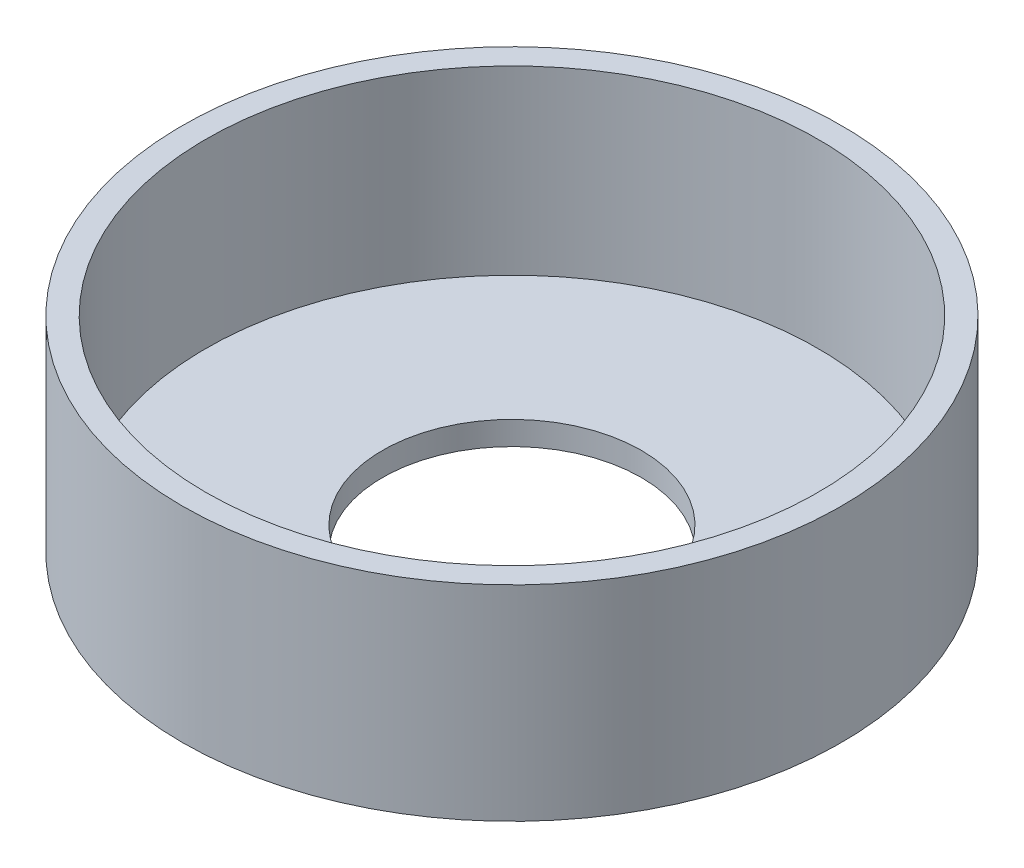
ISO-10303-21;
HEADER;
FILE_DESCRIPTION(('STEP AP214'),'2;1');
FILE_NAME('part.step','',(''),(''),'','','');
FILE_SCHEMA(('AUTOMOTIVE_DESIGN { 1 0 10303 214 1 1 1 1 }'));
ENDSEC;
DATA;
#1=APPLICATION_CONTEXT('core data for automotive mechanical design processes');
#2=APPLICATION_PROTOCOL_DEFINITION('international standard','automotive_design',2000,#1);
#3=PRODUCT_CONTEXT('',#1,'mechanical');
#4=PRODUCT('Part','Part','',(#3));
#5=PRODUCT_RELATED_PRODUCT_CATEGORY('part','',(#4));
#6=PRODUCT_DEFINITION_FORMATION('','',#4);
#7=PRODUCT_DEFINITION_CONTEXT('part definition',#1,'design');
#8=PRODUCT_DEFINITION('design','',#6,#7);
#9=PRODUCT_DEFINITION_SHAPE('','',#8);
#10=(LENGTH_UNIT() NAMED_UNIT(*) SI_UNIT(.MILLI.,.METRE.));
#11=(NAMED_UNIT(*) PLANE_ANGLE_UNIT() SI_UNIT($,.RADIAN.));
#12=(NAMED_UNIT(*) SI_UNIT($,.STERADIAN.) SOLID_ANGLE_UNIT());
#13=UNCERTAINTY_MEASURE_WITH_UNIT(LENGTH_MEASURE(1.E-05),#10,'distance_accuracy_value','');
#14=(GEOMETRIC_REPRESENTATION_CONTEXT(3) GLOBAL_UNCERTAINTY_ASSIGNED_CONTEXT((#13)) GLOBAL_UNIT_ASSIGNED_CONTEXT((#10,
#11,#12)) REPRESENTATION_CONTEXT('',''));
#15=CARTESIAN_POINT('',(0.,0.,0.));
#16=DIRECTION('',(0.,0.,1.));
#17=DIRECTION('',(1.,0.,0.));
#18=AXIS2_PLACEMENT_3D('',#15,#16,#17);
#19=CARTESIAN_POINT('',(0.,11.049,0.));
#20=DIRECTION('',(0.,-1.,0.));
#21=DIRECTION('',(0.,0.,-1.));
#22=AXIS2_PLACEMENT_3D('',#19,#20,#21);
#23=CYLINDRICAL_SURFACE('',#22,17.78);
#24=CARTESIAN_POINT('',(0.,11.049,0.));
#25=DIRECTION('',(0.,1.,0.));
#26=DIRECTION('',(0.,0.,1.));
#27=AXIS2_PLACEMENT_3D('',#24,#25,#26);
#28=CIRCLE('',#27,17.78);
#29=CARTESIAN_POINT('',(0.,11.049,17.78));
#30=VERTEX_POINT('',#29);
#31=EDGE_CURVE('E10',#30,#30,#28,.T.);
#32=ORIENTED_EDGE('',*,*,#31,.F.);
#33=EDGE_LOOP('',(#32));
#34=FACE_BOUND('',#33,.T.);
#35=CARTESIAN_POINT('',(0.,0.,0.));
#36=DIRECTION('',(0.,1.,0.));
#37=DIRECTION('',(0.,0.,1.));
#38=AXIS2_PLACEMENT_3D('',#35,#36,#37);
#39=CIRCLE('',#38,17.78);
#40=CARTESIAN_POINT('',(0.,0.,17.78));
#41=VERTEX_POINT('',#40);
#42=EDGE_CURVE('E33',#41,#41,#39,.T.);
#43=ORIENTED_EDGE('',*,*,#42,.T.);
#44=EDGE_LOOP('',(#43));
#45=FACE_BOUND('',#44,.T.);
#46=ADVANCED_FACE('F30',(#34,#45),#23,.T.);
#47=CARTESIAN_POINT('',(0.,11.049,0.));
#48=DIRECTION('',(0.,1.,0.));
#49=DIRECTION('',(0.,0.,1.));
#50=AXIS2_PLACEMENT_3D('',#47,#48,#49);
#51=PLANE('',#50);
#52=CARTESIAN_POINT('',(0.,11.049,0.));
#53=DIRECTION('',(0.,1.,0.));
#54=DIRECTION('',(0.,0.,1.));
#55=AXIS2_PLACEMENT_3D('',#52,#53,#54);
#56=CIRCLE('',#55,16.51);
#57=CARTESIAN_POINT('',(0.,11.049,16.51));
#58=VERTEX_POINT('',#57);
#59=EDGE_CURVE('E40',#58,#58,#56,.T.);
#60=ORIENTED_EDGE('',*,*,#59,.F.);
#61=EDGE_LOOP('',(#60));
#62=FACE_BOUND('',#61,.T.);
#63=ORIENTED_EDGE('',*,*,#31,.T.);
#64=EDGE_LOOP('',(#63));
#65=FACE_BOUND('',#64,.T.);
#66=ADVANCED_FACE('F76',(#62,#65),#51,.T.);
#67=CARTESIAN_POINT('',(0.,0.,0.));
#68=DIRECTION('',(0.,1.,0.));
#69=DIRECTION('',(0.,0.,1.));
#70=AXIS2_PLACEMENT_3D('',#67,#68,#69);
#71=PLANE('',#70);
#72=CARTESIAN_POINT('',(0.,0.,0.));
#73=DIRECTION('',(0.,1.,0.));
#74=DIRECTION('',(0.,0.,1.));
#75=AXIS2_PLACEMENT_3D('',#72,#73,#74);
#76=CIRCLE('',#75,6.985);
#77=CARTESIAN_POINT('',(0.,0.,6.985));
#78=VERTEX_POINT('',#77);
#79=EDGE_CURVE('E47',#78,#78,#76,.T.);
#80=ORIENTED_EDGE('',*,*,#79,.T.);
#81=EDGE_LOOP('',(#80));
#82=FACE_BOUND('',#81,.T.);
#83=ORIENTED_EDGE('',*,*,#42,.F.);
#84=EDGE_LOOP('',(#83));
#85=FACE_BOUND('',#84,.T.);
#86=ADVANCED_FACE('F54',(#82,#85),#71,.F.);
#87=CARTESIAN_POINT('',(0.,11.049,0.));
#88=DIRECTION('',(0.,-1.,0.));
#89=DIRECTION('',(0.,0.,-1.));
#90=AXIS2_PLACEMENT_3D('',#87,#88,#89);
#91=CYLINDRICAL_SURFACE('',#90,16.51);
#92=ORIENTED_EDGE('',*,*,#59,.T.);
#93=EDGE_LOOP('',(#92));
#94=FACE_BOUND('',#93,.T.);
#95=CARTESIAN_POINT('',(0.,1.27,0.));
#96=DIRECTION('',(0.,1.,0.));
#97=DIRECTION('',(0.,0.,1.));
#98=AXIS2_PLACEMENT_3D('',#95,#96,#97);
#99=CIRCLE('',#98,16.51);
#100=CARTESIAN_POINT('',(0.,1.27,16.51));
#101=VERTEX_POINT('',#100);
#102=EDGE_CURVE('E44',#101,#101,#99,.T.);
#103=ORIENTED_EDGE('',*,*,#102,.F.);
#104=EDGE_LOOP('',(#103));
#105=FACE_BOUND('',#104,.T.);
#106=ADVANCED_FACE('F66',(#94,#105),#91,.F.);
#107=CARTESIAN_POINT('',(0.,1.27,0.));
#108=DIRECTION('',(0.,1.,0.));
#109=DIRECTION('',(0.,0.,1.));
#110=AXIS2_PLACEMENT_3D('',#107,#108,#109);
#111=PLANE('',#110);
#112=CARTESIAN_POINT('',(0.,1.27,0.));
#113=DIRECTION('',(0.,1.,0.));
#114=DIRECTION('',(0.,0.,1.));
#115=AXIS2_PLACEMENT_3D('',#112,#113,#114);
#116=CIRCLE('',#115,6.985);
#117=CARTESIAN_POINT('',(0.,1.27,6.985));
#118=VERTEX_POINT('',#117);
#119=EDGE_CURVE('E48',#118,#118,#116,.T.);
#120=ORIENTED_EDGE('',*,*,#119,.F.);
#121=EDGE_LOOP('',(#120));
#122=FACE_BOUND('',#121,.T.);
#123=ORIENTED_EDGE('',*,*,#102,.T.);
#124=EDGE_LOOP('',(#123));
#125=FACE_BOUND('',#124,.T.);
#126=ADVANCED_FACE('F60',(#122,#125),#111,.T.);
#127=CARTESIAN_POINT('',(0.,0.,0.));
#128=DIRECTION('',(0.,1.,0.));
#129=DIRECTION('',(0.,0.,1.));
#130=AXIS2_PLACEMENT_3D('',#127,#128,#129);
#131=CYLINDRICAL_SURFACE('',#130,6.985);
#132=ORIENTED_EDGE('',*,*,#79,.F.);
#133=EDGE_LOOP('',(#132));
#134=FACE_BOUND('',#133,.T.);
#135=ORIENTED_EDGE('',*,*,#119,.T.);
#136=EDGE_LOOP('',(#135));
#137=FACE_BOUND('',#136,.T.);
#138=ADVANCED_FACE('F57',(#134,#137),#131,.F.);
#139=CLOSED_SHELL('',(#46,#66,#86,#106,#126,#138));
#140=MANIFOLD_SOLID_BREP('B2',#139);
#141=ADVANCED_BREP_SHAPE_REPRESENTATION('',(#18,#140),#14);
#142=SHAPE_DEFINITION_REPRESENTATION(#9,#141);
ENDSEC;
END-ISO-10303-21;
